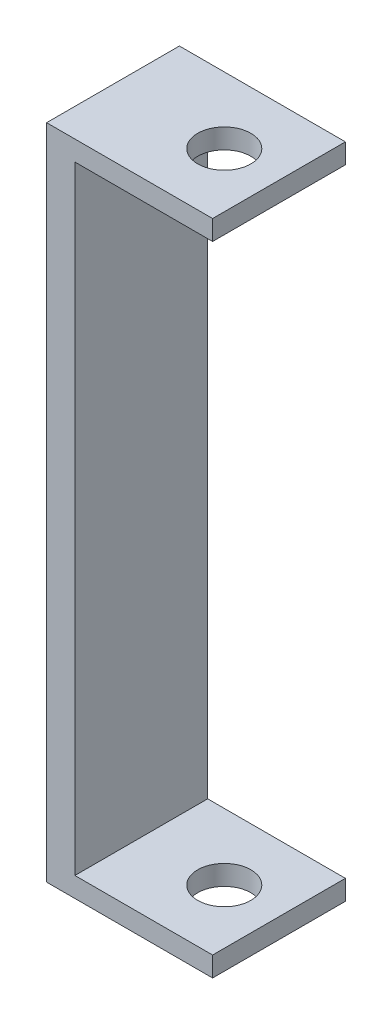
ISO-10303-21;
HEADER;
FILE_DESCRIPTION(('STEP AP214'),'2;1');
FILE_NAME('part.step','',(''),(''),'','','');
FILE_SCHEMA(('AUTOMOTIVE_DESIGN { 1 0 10303 214 1 1 1 1 }'));
ENDSEC;
DATA;
#1=APPLICATION_CONTEXT('core data for automotive mechanical design processes');
#2=APPLICATION_PROTOCOL_DEFINITION('international standard','automotive_design',2000,#1);
#3=PRODUCT_CONTEXT('',#1,'mechanical');
#4=PRODUCT('Part','Part','',(#3));
#5=PRODUCT_RELATED_PRODUCT_CATEGORY('part','',(#4));
#6=PRODUCT_DEFINITION_FORMATION('','',#4);
#7=PRODUCT_DEFINITION_CONTEXT('part definition',#1,'design');
#8=PRODUCT_DEFINITION('design','',#6,#7);
#9=PRODUCT_DEFINITION_SHAPE('','',#8);
#10=(LENGTH_UNIT() NAMED_UNIT(*) SI_UNIT(.MILLI.,.METRE.));
#11=(NAMED_UNIT(*) PLANE_ANGLE_UNIT() SI_UNIT($,.RADIAN.));
#12=(NAMED_UNIT(*) SI_UNIT($,.STERADIAN.) SOLID_ANGLE_UNIT());
#13=UNCERTAINTY_MEASURE_WITH_UNIT(LENGTH_MEASURE(1.E-05),#10,'distance_accuracy_value','');
#14=(GEOMETRIC_REPRESENTATION_CONTEXT(3) GLOBAL_UNCERTAINTY_ASSIGNED_CONTEXT((#13)) GLOBAL_UNIT_ASSIGNED_CONTEXT((#10,
#11,#12)) REPRESENTATION_CONTEXT('',''));
#15=CARTESIAN_POINT('',(0.,0.,0.));
#16=DIRECTION('',(0.,0.,1.));
#17=DIRECTION('',(1.,0.,0.));
#18=AXIS2_PLACEMENT_3D('',#15,#16,#17);
#19=CARTESIAN_POINT('',(0.,3.,0.));
#20=DIRECTION('',(0.,-1.,0.));
#21=DIRECTION('',(0.,0.,-1.));
#22=AXIS2_PLACEMENT_3D('',#19,#20,#21);
#23=PLANE('',#22);
#24=CARTESIAN_POINT('',(16.7600666276887,3.,-10.));
#25=DIRECTION('',(0.,1.,0.));
#26=DIRECTION('',(0.,0.,1.));
#27=AXIS2_PLACEMENT_3D('',#24,#25,#26);
#28=CIRCLE('',#27,4.);
#29=CARTESIAN_POINT('',(16.7600666276887,3.,-6.));
#30=VERTEX_POINT('',#29);
#31=EDGE_CURVE('E110',#30,#30,#28,.T.);
#32=ORIENTED_EDGE('',*,*,#31,.F.);
#33=EDGE_LOOP('',(#32));
#34=FACE_BOUND('',#33,.T.);
#35=DIRECTION('',(0.,0.,-1.));
#36=VECTOR('',#35,1.);
#37=CARTESIAN_POINT('',(4.2600666276887,3.,-20.));
#38=LINE('',#37,#36);
#39=CARTESIAN_POINT('',(4.26006662768869,3.,0.));
#40=VERTEX_POINT('',#39);
#41=CARTESIAN_POINT('',(4.2600666276887,3.,-20.));
#42=VERTEX_POINT('',#41);
#43=EDGE_CURVE('E53',#40,#42,#38,.T.);
#44=ORIENTED_EDGE('',*,*,#43,.F.);
#45=DIRECTION('',(1.,0.,0.));
#46=VECTOR('',#45,1.);
#47=CARTESIAN_POINT('',(0.,3.,0.));
#48=LINE('',#47,#46);
#49=CARTESIAN_POINT('',(25.,3.,0.));
#50=VERTEX_POINT('',#49);
#51=EDGE_CURVE('E95',#40,#50,#48,.T.);
#52=ORIENTED_EDGE('',*,*,#51,.T.);
#53=DIRECTION('',(0.,0.,-1.));
#54=VECTOR('',#53,1.);
#55=CARTESIAN_POINT('',(25.,3.,0.));
#56=LINE('',#55,#54);
#57=CARTESIAN_POINT('',(25.,3.,-20.));
#58=VERTEX_POINT('',#57);
#59=EDGE_CURVE('E58',#50,#58,#56,.T.);
#60=ORIENTED_EDGE('',*,*,#59,.T.);
#61=DIRECTION('',(-1.,0.,0.));
#62=VECTOR('',#61,1.);
#63=CARTESIAN_POINT('',(0.,3.,-20.));
#64=LINE('',#63,#62);
#65=EDGE_CURVE('E105',#58,#42,#64,.T.);
#66=ORIENTED_EDGE('',*,*,#65,.T.);
#67=EDGE_LOOP('',(#44,#52,#60,#66));
#68=FACE_BOUND('',#67,.T.);
#69=ADVANCED_FACE('F39',(#34,#68),#23,.F.);
#70=CARTESIAN_POINT('',(0.,0.,0.));
#71=DIRECTION('',(0.,-1.,0.));
#72=DIRECTION('',(0.,0.,-1.));
#73=AXIS2_PLACEMENT_3D('',#70,#71,#72);
#74=PLANE('',#73);
#75=DIRECTION('',(0.,0.,1.));
#76=VECTOR('',#75,1.);
#77=CARTESIAN_POINT('',(0.,0.,0.));
#78=LINE('',#77,#76);
#79=CARTESIAN_POINT('',(0.,0.,-20.));
#80=VERTEX_POINT('',#79);
#81=CARTESIAN_POINT('',(0.,0.,0.));
#82=VERTEX_POINT('',#81);
#83=EDGE_CURVE('E97',#80,#82,#78,.T.);
#84=ORIENTED_EDGE('',*,*,#83,.F.);
#85=DIRECTION('',(-1.,0.,0.));
#86=VECTOR('',#85,1.);
#87=CARTESIAN_POINT('',(0.,0.,-20.));
#88=LINE('',#87,#86);
#89=CARTESIAN_POINT('',(25.,0.,-20.));
#90=VERTEX_POINT('',#89);
#91=EDGE_CURVE('E78',#90,#80,#88,.T.);
#92=ORIENTED_EDGE('',*,*,#91,.F.);
#93=DIRECTION('',(0.,0.,-1.));
#94=VECTOR('',#93,1.);
#95=CARTESIAN_POINT('',(25.,0.,0.));
#96=LINE('',#95,#94);
#97=CARTESIAN_POINT('',(25.,0.,0.));
#98=VERTEX_POINT('',#97);
#99=EDGE_CURVE('E91',#98,#90,#96,.T.);
#100=ORIENTED_EDGE('',*,*,#99,.F.);
#101=DIRECTION('',(1.,0.,0.));
#102=VECTOR('',#101,1.);
#103=CARTESIAN_POINT('',(0.,0.,0.));
#104=LINE('',#103,#102);
#105=EDGE_CURVE('E106',#82,#98,#104,.T.);
#106=ORIENTED_EDGE('',*,*,#105,.F.);
#107=EDGE_LOOP('',(#84,#92,#100,#106));
#108=FACE_BOUND('',#107,.T.);
#109=CARTESIAN_POINT('',(16.7600666276887,0.,-10.));
#110=DIRECTION('',(0.,1.,0.));
#111=DIRECTION('',(0.,0.,1.));
#112=AXIS2_PLACEMENT_3D('',#109,#110,#111);
#113=CIRCLE('',#112,4.);
#114=CARTESIAN_POINT('',(16.7600666276887,0.,-6.));
#115=VERTEX_POINT('',#114);
#116=EDGE_CURVE('E112',#115,#115,#113,.T.);
#117=ORIENTED_EDGE('',*,*,#116,.T.);
#118=EDGE_LOOP('',(#117));
#119=FACE_BOUND('',#118,.T.);
#120=ADVANCED_FACE('F102',(#108,#119),#74,.T.);
#121=CARTESIAN_POINT('',(0.,3.,0.));
#122=DIRECTION('',(1.,0.,0.));
#123=DIRECTION('',(0.,0.,-1.));
#124=AXIS2_PLACEMENT_3D('',#121,#122,#123);
#125=PLANE('',#124);
#126=ORIENTED_EDGE('',*,*,#83,.T.);
#127=DIRECTION('',(0.,-1.,0.));
#128=VECTOR('',#127,1.);
#129=CARTESIAN_POINT('',(0.,3.,0.));
#130=LINE('',#129,#128);
#131=CARTESIAN_POINT('',(0.,99.06,0.));
#132=VERTEX_POINT('',#131);
#133=EDGE_CURVE('E11',#132,#82,#130,.T.);
#134=ORIENTED_EDGE('',*,*,#133,.F.);
#135=DIRECTION('',(0.,0.,1.));
#136=VECTOR('',#135,1.);
#137=CARTESIAN_POINT('',(0.,99.06,-20.));
#138=LINE('',#137,#136);
#139=CARTESIAN_POINT('',(0.,99.06,-20.));
#140=VERTEX_POINT('',#139);
#141=EDGE_CURVE('E101',#140,#132,#138,.T.);
#142=ORIENTED_EDGE('',*,*,#141,.F.);
#143=DIRECTION('',(0.,-1.,0.));
#144=VECTOR('',#143,1.);
#145=CARTESIAN_POINT('',(0.,3.,-20.));
#146=LINE('',#145,#144);
#147=EDGE_CURVE('E83',#140,#80,#146,.T.);
#148=ORIENTED_EDGE('',*,*,#147,.T.);
#149=EDGE_LOOP('',(#126,#134,#142,#148));
#150=FACE_BOUND('',#149,.T.);
#151=ADVANCED_FACE('F41',(#150),#125,.F.);
#152=CARTESIAN_POINT('',(0.,3.,0.));
#153=DIRECTION('',(0.,0.,-1.));
#154=DIRECTION('',(-1.,0.,0.));
#155=AXIS2_PLACEMENT_3D('',#152,#153,#154);
#156=PLANE('',#155);
#157=ORIENTED_EDGE('',*,*,#105,.T.);
#158=DIRECTION('',(0.,-1.,0.));
#159=VECTOR('',#158,1.);
#160=CARTESIAN_POINT('',(25.,3.,0.));
#161=LINE('',#160,#159);
#162=EDGE_CURVE('E50',#50,#98,#161,.T.);
#163=ORIENTED_EDGE('',*,*,#162,.F.);
#164=ORIENTED_EDGE('',*,*,#51,.F.);
#165=DIRECTION('',(0.,-1.,0.));
#166=VECTOR('',#165,1.);
#167=CARTESIAN_POINT('',(4.2600666276887,96.06,0.));
#168=LINE('',#167,#166);
#169=CARTESIAN_POINT('',(4.2600666276887,96.06,0.));
#170=VERTEX_POINT('',#169);
#171=EDGE_CURVE('E152',#170,#40,#168,.T.);
#172=ORIENTED_EDGE('',*,*,#171,.F.);
#173=DIRECTION('',(1.,0.,0.));
#174=VECTOR('',#173,1.);
#175=CARTESIAN_POINT('',(0.,96.06,0.));
#176=LINE('',#175,#174);
#177=CARTESIAN_POINT('',(25.,96.06,0.));
#178=VERTEX_POINT('',#177);
#179=EDGE_CURVE('E267',#170,#178,#176,.T.);
#180=ORIENTED_EDGE('',*,*,#179,.T.);
#181=DIRECTION('',(0.,-1.,0.));
#182=VECTOR('',#181,1.);
#183=CARTESIAN_POINT('',(25.,99.06,0.));
#184=LINE('',#183,#182);
#185=CARTESIAN_POINT('',(25.,99.06,0.));
#186=VERTEX_POINT('',#185);
#187=EDGE_CURVE('E156',#186,#178,#184,.T.);
#188=ORIENTED_EDGE('',*,*,#187,.F.);
#189=DIRECTION('',(1.,0.,0.));
#190=VECTOR('',#189,1.);
#191=CARTESIAN_POINT('',(0.,99.06,0.));
#192=LINE('',#191,#190);
#193=EDGE_CURVE('E129',#132,#186,#192,.T.);
#194=ORIENTED_EDGE('',*,*,#193,.F.);
#195=ORIENTED_EDGE('',*,*,#133,.T.);
#196=EDGE_LOOP('',(#157,#163,#164,#172,#180,#188,#194,#195));
#197=FACE_BOUND('',#196,.T.);
#198=ADVANCED_FACE('F125',(#197),#156,.F.);
#199=CARTESIAN_POINT('',(25.,3.,0.));
#200=DIRECTION('',(-1.,0.,0.));
#201=DIRECTION('',(0.,0.,1.));
#202=AXIS2_PLACEMENT_3D('',#199,#200,#201);
#203=PLANE('',#202);
#204=ORIENTED_EDGE('',*,*,#99,.T.);
#205=DIRECTION('',(0.,-1.,0.));
#206=VECTOR('',#205,1.);
#207=CARTESIAN_POINT('',(25.,3.,-20.));
#208=LINE('',#207,#206);
#209=EDGE_CURVE('E86',#58,#90,#208,.T.);
#210=ORIENTED_EDGE('',*,*,#209,.F.);
#211=ORIENTED_EDGE('',*,*,#59,.F.);
#212=ORIENTED_EDGE('',*,*,#162,.T.);
#213=EDGE_LOOP('',(#204,#210,#211,#212));
#214=FACE_BOUND('',#213,.T.);
#215=ADVANCED_FACE('F118',(#214),#203,.F.);
#216=CARTESIAN_POINT('',(0.,3.,-20.));
#217=DIRECTION('',(0.,0.,1.));
#218=DIRECTION('',(1.,0.,0.));
#219=AXIS2_PLACEMENT_3D('',#216,#217,#218);
#220=PLANE('',#219);
#221=ORIENTED_EDGE('',*,*,#91,.T.);
#222=ORIENTED_EDGE('',*,*,#147,.F.);
#223=DIRECTION('',(-1.,0.,0.));
#224=VECTOR('',#223,1.);
#225=CARTESIAN_POINT('',(0.,99.06,-20.));
#226=LINE('',#225,#224);
#227=CARTESIAN_POINT('',(25.,99.06,-20.));
#228=VERTEX_POINT('',#227);
#229=EDGE_CURVE('E277',#228,#140,#226,.T.);
#230=ORIENTED_EDGE('',*,*,#229,.F.);
#231=DIRECTION('',(0.,-1.,0.));
#232=VECTOR('',#231,1.);
#233=CARTESIAN_POINT('',(25.,99.06,-20.));
#234=LINE('',#233,#232);
#235=CARTESIAN_POINT('',(25.,96.06,-20.));
#236=VERTEX_POINT('',#235);
#237=EDGE_CURVE('E279',#228,#236,#234,.T.);
#238=ORIENTED_EDGE('',*,*,#237,.T.);
#239=DIRECTION('',(-1.,0.,0.));
#240=VECTOR('',#239,1.);
#241=CARTESIAN_POINT('',(0.,96.06,-20.));
#242=LINE('',#241,#240);
#243=CARTESIAN_POINT('',(4.26006662768869,96.06,-20.));
#244=VERTEX_POINT('',#243);
#245=EDGE_CURVE('E161',#236,#244,#242,.T.);
#246=ORIENTED_EDGE('',*,*,#245,.T.);
#247=DIRECTION('',(0.,-1.,0.));
#248=VECTOR('',#247,1.);
#249=CARTESIAN_POINT('',(4.2600666276887,96.06,-20.));
#250=LINE('',#249,#248);
#251=EDGE_CURVE('E155',#244,#42,#250,.T.);
#252=ORIENTED_EDGE('',*,*,#251,.T.);
#253=ORIENTED_EDGE('',*,*,#65,.F.);
#254=ORIENTED_EDGE('',*,*,#209,.T.);
#255=EDGE_LOOP('',(#221,#222,#230,#238,#246,#252,#253,#254));
#256=FACE_BOUND('',#255,.T.);
#257=ADVANCED_FACE('F85',(#256),#220,.F.);
#258=CARTESIAN_POINT('',(16.7600666276887,3.,-10.));
#259=DIRECTION('',(0.,-1.,0.));
#260=DIRECTION('',(0.,0.,-1.));
#261=AXIS2_PLACEMENT_3D('',#258,#259,#260);
#262=CYLINDRICAL_SURFACE('',#261,4.);
#263=ORIENTED_EDGE('',*,*,#31,.T.);
#264=EDGE_LOOP('',(#263));
#265=FACE_BOUND('',#264,.T.);
#266=ORIENTED_EDGE('',*,*,#116,.F.);
#267=EDGE_LOOP('',(#266));
#268=FACE_BOUND('',#267,.T.);
#269=ADVANCED_FACE('F168',(#265,#268),#262,.F.);
#270=CARTESIAN_POINT('',(4.2600666276887,96.06,-20.));
#271=DIRECTION('',(-1.,0.,0.));
#272=DIRECTION('',(0.,0.,1.));
#273=AXIS2_PLACEMENT_3D('',#270,#271,#272);
#274=PLANE('',#273);
#275=ORIENTED_EDGE('',*,*,#43,.T.);
#276=ORIENTED_EDGE('',*,*,#251,.F.);
#277=DIRECTION('',(0.,0.,-1.));
#278=VECTOR('',#277,1.);
#279=CARTESIAN_POINT('',(4.2600666276887,96.06,-20.));
#280=LINE('',#279,#278);
#281=EDGE_CURVE('E154',#170,#244,#280,.T.);
#282=ORIENTED_EDGE('',*,*,#281,.F.);
#283=ORIENTED_EDGE('',*,*,#171,.T.);
#284=EDGE_LOOP('',(#275,#276,#282,#283));
#285=FACE_BOUND('',#284,.T.);
#286=ADVANCED_FACE('F147',(#285),#274,.F.);
#287=CARTESIAN_POINT('',(0.,96.06,0.));
#288=DIRECTION('',(0.,1.,0.));
#289=DIRECTION('',(0.,0.,1.));
#290=AXIS2_PLACEMENT_3D('',#287,#288,#289);
#291=PLANE('',#290);
#292=CARTESIAN_POINT('',(16.7600666276887,96.06,-10.));
#293=DIRECTION('',(0.,1.,0.));
#294=DIRECTION('',(0.,0.,1.));
#295=AXIS2_PLACEMENT_3D('',#292,#293,#294);
#296=CIRCLE('',#295,4.);
#297=CARTESIAN_POINT('',(16.7600666276887,96.06,-6.));
#298=VERTEX_POINT('',#297);
#299=EDGE_CURVE('E270',#298,#298,#296,.T.);
#300=ORIENTED_EDGE('',*,*,#299,.T.);
#301=EDGE_LOOP('',(#300));
#302=FACE_BOUND('',#301,.T.);
#303=ORIENTED_EDGE('',*,*,#179,.F.);
#304=ORIENTED_EDGE('',*,*,#281,.T.);
#305=ORIENTED_EDGE('',*,*,#245,.F.);
#306=DIRECTION('',(0.,0.,-1.));
#307=VECTOR('',#306,1.);
#308=CARTESIAN_POINT('',(25.,96.06,-20.));
#309=LINE('',#308,#307);
#310=EDGE_CURVE('E278',#178,#236,#309,.T.);
#311=ORIENTED_EDGE('',*,*,#310,.F.);
#312=EDGE_LOOP('',(#303,#304,#305,#311));
#313=FACE_BOUND('',#312,.T.);
#314=ADVANCED_FACE('F176',(#302,#313),#291,.F.);
#315=CARTESIAN_POINT('',(0.,99.06,0.));
#316=DIRECTION('',(0.,1.,0.));
#317=DIRECTION('',(0.,0.,1.));
#318=AXIS2_PLACEMENT_3D('',#315,#316,#317);
#319=PLANE('',#318);
#320=ORIENTED_EDGE('',*,*,#141,.T.);
#321=ORIENTED_EDGE('',*,*,#193,.T.);
#322=DIRECTION('',(0.,0.,-1.));
#323=VECTOR('',#322,1.);
#324=CARTESIAN_POINT('',(25.,99.06,-20.));
#325=LINE('',#324,#323);
#326=EDGE_CURVE('E273',#186,#228,#325,.T.);
#327=ORIENTED_EDGE('',*,*,#326,.T.);
#328=ORIENTED_EDGE('',*,*,#229,.T.);
#329=EDGE_LOOP('',(#320,#321,#327,#328));
#330=FACE_BOUND('',#329,.T.);
#331=CARTESIAN_POINT('',(16.7600666276887,99.06,-10.));
#332=DIRECTION('',(0.,1.,0.));
#333=DIRECTION('',(0.,0.,1.));
#334=AXIS2_PLACEMENT_3D('',#331,#332,#333);
#335=CIRCLE('',#334,4.);
#336=CARTESIAN_POINT('',(16.7600666276887,99.06,-6.));
#337=VERTEX_POINT('',#336);
#338=EDGE_CURVE('E262',#337,#337,#335,.T.);
#339=ORIENTED_EDGE('',*,*,#338,.F.);
#340=EDGE_LOOP('',(#339));
#341=FACE_BOUND('',#340,.T.);
#342=ADVANCED_FACE('F229',(#330,#341),#319,.T.);
#343=CARTESIAN_POINT('',(25.,99.06,-20.));
#344=DIRECTION('',(-1.,0.,0.));
#345=DIRECTION('',(0.,0.,1.));
#346=AXIS2_PLACEMENT_3D('',#343,#344,#345);
#347=PLANE('',#346);
#348=ORIENTED_EDGE('',*,*,#310,.T.);
#349=ORIENTED_EDGE('',*,*,#237,.F.);
#350=ORIENTED_EDGE('',*,*,#326,.F.);
#351=ORIENTED_EDGE('',*,*,#187,.T.);
#352=EDGE_LOOP('',(#348,#349,#350,#351));
#353=FACE_BOUND('',#352,.T.);
#354=ADVANCED_FACE('F236',(#353),#347,.F.);
#355=CARTESIAN_POINT('',(16.7600666276887,99.06,-10.));
#356=DIRECTION('',(0.,-1.,0.));
#357=DIRECTION('',(0.,0.,-1.));
#358=AXIS2_PLACEMENT_3D('',#355,#356,#357);
#359=CYLINDRICAL_SURFACE('',#358,4.);
#360=ORIENTED_EDGE('',*,*,#338,.T.);
#361=EDGE_LOOP('',(#360));
#362=FACE_BOUND('',#361,.T.);
#363=ORIENTED_EDGE('',*,*,#299,.F.);
#364=EDGE_LOOP('',(#363));
#365=FACE_BOUND('',#364,.T.);
#366=ADVANCED_FACE('F249',(#362,#365),#359,.F.);
#367=CLOSED_SHELL('',(#69,#120,#151,#198,#215,#257,#269,#286,#314,#342,#354,#366));
#368=MANIFOLD_SOLID_BREP('B2',#367);
#369=ADVANCED_BREP_SHAPE_REPRESENTATION('',(#18,#368),#14);
#370=SHAPE_DEFINITION_REPRESENTATION(#9,#369);
ENDSEC;
END-ISO-10303-21;
